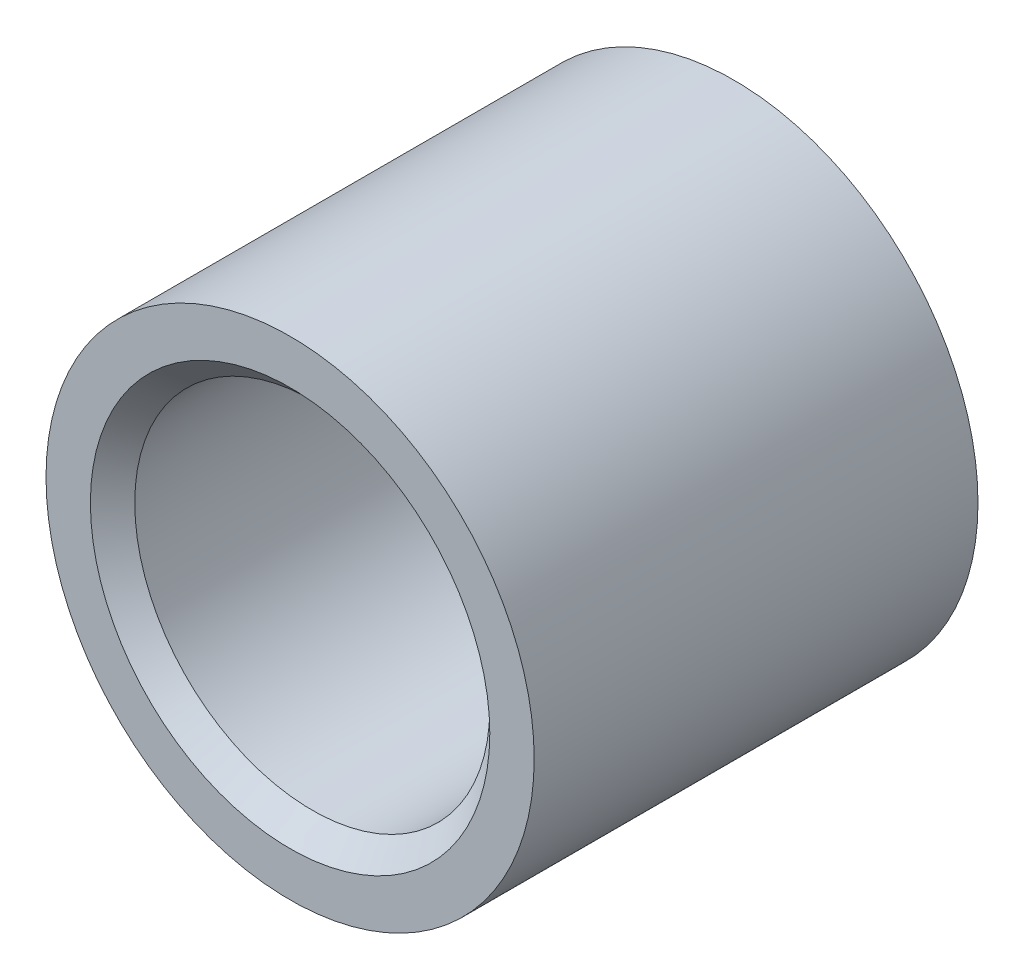
ISO-10303-21;
HEADER;
FILE_DESCRIPTION(('STEP AP214'),'2;1');
FILE_NAME('part.step','',(''),(''),'','','');
FILE_SCHEMA(('AUTOMOTIVE_DESIGN { 1 0 10303 214 1 1 1 1 }'));
ENDSEC;
DATA;
#1=APPLICATION_CONTEXT('core data for automotive mechanical design processes');
#2=APPLICATION_PROTOCOL_DEFINITION('international standard','automotive_design',2000,#1);
#3=PRODUCT_CONTEXT('',#1,'mechanical');
#4=PRODUCT('Part','Part','',(#3));
#5=PRODUCT_RELATED_PRODUCT_CATEGORY('part','',(#4));
#6=PRODUCT_DEFINITION_FORMATION('','',#4);
#7=PRODUCT_DEFINITION_CONTEXT('part definition',#1,'design');
#8=PRODUCT_DEFINITION('design','',#6,#7);
#9=PRODUCT_DEFINITION_SHAPE('','',#8);
#10=(LENGTH_UNIT() NAMED_UNIT(*) SI_UNIT(.MILLI.,.METRE.));
#11=(NAMED_UNIT(*) PLANE_ANGLE_UNIT() SI_UNIT($,.RADIAN.));
#12=(NAMED_UNIT(*) SI_UNIT($,.STERADIAN.) SOLID_ANGLE_UNIT());
#13=UNCERTAINTY_MEASURE_WITH_UNIT(LENGTH_MEASURE(1.E-05),#10,'distance_accuracy_value','');
#14=(GEOMETRIC_REPRESENTATION_CONTEXT(3) GLOBAL_UNCERTAINTY_ASSIGNED_CONTEXT((#13)) GLOBAL_UNIT_ASSIGNED_CONTEXT((#10,
#11,#12)) REPRESENTATION_CONTEXT('',''));
#15=CARTESIAN_POINT('',(0.,0.,0.));
#16=DIRECTION('',(0.,0.,1.));
#17=DIRECTION('',(1.,0.,0.));
#18=AXIS2_PLACEMENT_3D('',#15,#16,#17);
#19=CARTESIAN_POINT('',(0.,0.,25.4));
#20=DIRECTION('',(0.,0.,1.));
#21=DIRECTION('',(1.,0.,0.));
#22=AXIS2_PLACEMENT_3D('',#19,#20,#21);
#23=PLANE('',#22);
#24=CARTESIAN_POINT('',(0.,0.,25.4));
#25=DIRECTION('',(0.,0.,1.));
#26=DIRECTION('',(1.,0.,0.));
#27=AXIS2_PLACEMENT_3D('',#24,#25,#26);
#28=CIRCLE('',#27,11.43);
#29=CARTESIAN_POINT('',(11.43,0.,25.4));
#30=VERTEX_POINT('',#29);
#31=EDGE_CURVE('E10',#30,#30,#28,.F.);
#32=ORIENTED_EDGE('',*,*,#31,.T.);
#33=EDGE_LOOP('',(#32));
#34=FACE_BOUND('',#33,.T.);
#35=CARTESIAN_POINT('',(0.,0.,25.4));
#36=DIRECTION('',(0.,0.,1.));
#37=DIRECTION('',(1.,0.,0.));
#38=AXIS2_PLACEMENT_3D('',#35,#36,#37);
#39=CIRCLE('',#38,13.97);
#40=CARTESIAN_POINT('',(13.97,0.,25.4));
#41=VERTEX_POINT('',#40);
#42=EDGE_CURVE('E51',#41,#41,#39,.T.);
#43=ORIENTED_EDGE('',*,*,#42,.T.);
#44=EDGE_LOOP('',(#43));
#45=FACE_BOUND('',#44,.T.);
#46=ADVANCED_FACE('F31',(#34,#45),#23,.T.);
#47=CARTESIAN_POINT('',(0.,0.,0.));
#48=DIRECTION('',(0.,0.,1.));
#49=DIRECTION('',(1.,0.,0.));
#50=AXIS2_PLACEMENT_3D('',#47,#48,#49);
#51=PLANE('',#50);
#52=CARTESIAN_POINT('',(0.,0.,0.));
#53=DIRECTION('',(0.,0.,1.));
#54=DIRECTION('',(1.,0.,0.));
#55=AXIS2_PLACEMENT_3D('',#52,#53,#54);
#56=CIRCLE('',#55,11.43);
#57=CARTESIAN_POINT('',(-11.43,0.,0.));
#58=VERTEX_POINT('',#57);
#59=EDGE_CURVE('E46',#58,#58,#56,.T.);
#60=ORIENTED_EDGE('',*,*,#59,.T.);
#61=EDGE_LOOP('',(#60));
#62=FACE_BOUND('',#61,.T.);
#63=CARTESIAN_POINT('',(0.,0.,0.));
#64=DIRECTION('',(0.,0.,1.));
#65=DIRECTION('',(1.,0.,0.));
#66=AXIS2_PLACEMENT_3D('',#63,#64,#65);
#67=CIRCLE('',#66,13.97);
#68=CARTESIAN_POINT('',(13.97,0.,0.));
#69=VERTEX_POINT('',#68);
#70=EDGE_CURVE('E52',#69,#69,#67,.T.);
#71=ORIENTED_EDGE('',*,*,#70,.F.);
#72=EDGE_LOOP('',(#71));
#73=FACE_BOUND('',#72,.T.);
#74=ADVANCED_FACE('F63',(#62,#73),#51,.F.);
#75=CARTESIAN_POINT('',(0.,0.,25.4));
#76=DIRECTION('',(0.,0.,-1.));
#77=DIRECTION('',(-1.,0.,0.));
#78=AXIS2_PLACEMENT_3D('',#75,#76,#77);
#79=CYLINDRICAL_SURFACE('',#78,13.97);
#80=ORIENTED_EDGE('',*,*,#42,.F.);
#81=EDGE_LOOP('',(#80));
#82=FACE_BOUND('',#81,.T.);
#83=ORIENTED_EDGE('',*,*,#70,.T.);
#84=EDGE_LOOP('',(#83));
#85=FACE_BOUND('',#84,.T.);
#86=ADVANCED_FACE('F59',(#82,#85),#79,.T.);
#87=CARTESIAN_POINT('',(0.,0.,25.4));
#88=DIRECTION('',(0.,0.,-1.));
#89=DIRECTION('',(-1.,0.,0.));
#90=AXIS2_PLACEMENT_3D('',#87,#88,#89);
#91=CYLINDRICAL_SURFACE('',#90,10.16);
#92=CARTESIAN_POINT('',(0.,0.,1.27000000000001));
#93=DIRECTION('',(0.,0.,1.));
#94=DIRECTION('',(1.,0.,0.));
#95=AXIS2_PLACEMENT_3D('',#92,#93,#94);
#96=CIRCLE('',#95,10.16);
#97=CARTESIAN_POINT('',(-10.16,0.,1.27000000000001));
#98=VERTEX_POINT('',#97);
#99=EDGE_CURVE('E38',#98,#98,#96,.F.);
#100=ORIENTED_EDGE('',*,*,#99,.T.);
#101=EDGE_LOOP('',(#100));
#102=FACE_BOUND('',#101,.T.);
#103=CARTESIAN_POINT('',(0.,0.,24.13));
#104=DIRECTION('',(0.,0.,1.));
#105=DIRECTION('',(1.,0.,0.));
#106=AXIS2_PLACEMENT_3D('',#103,#104,#105);
#107=CIRCLE('',#106,10.16);
#108=CARTESIAN_POINT('',(10.16,0.,24.13));
#109=VERTEX_POINT('',#108);
#110=EDGE_CURVE('E42',#109,#109,#107,.T.);
#111=ORIENTED_EDGE('',*,*,#110,.T.);
#112=EDGE_LOOP('',(#111));
#113=FACE_BOUND('',#112,.T.);
#114=ADVANCED_FACE('F62',(#102,#113),#91,.F.);
#115=CARTESIAN_POINT('',(0.,0.,0.));
#116=DIRECTION('',(0.,0.,-1.));
#117=DIRECTION('',(-1.,0.,0.));
#118=AXIS2_PLACEMENT_3D('',#115,#116,#117);
#119=CONICAL_SURFACE('',#118,11.43,0.785398163397446);
#120=CARTESIAN_POINT('',(-10.16,0.,1.27000000000001));
#121=CARTESIAN_POINT('',(-10.1732291666667,0.,1.25677083333334));
#122=CARTESIAN_POINT('',(-10.1864583333333,0.,1.24354166666668));
#123=CARTESIAN_POINT('',(-10.2129166666667,0.,1.21708333333334));
#124=CARTESIAN_POINT('',(-10.2261458333333,0.,1.20385416666668));
#125=CARTESIAN_POINT('',(-10.2526041666667,0.,1.17739583333334));
#126=CARTESIAN_POINT('',(-10.2658333333333,0.,1.16416666666668));
#127=CARTESIAN_POINT('',(-10.2922916666667,0.,1.13770833333334));
#128=CARTESIAN_POINT('',(-10.3055208333333,0.,1.12447916666668));
#129=CARTESIAN_POINT('',(-10.3319791666667,0.,1.09802083333334));
#130=CARTESIAN_POINT('',(-10.3452083333333,0.,1.08479166666668));
#131=CARTESIAN_POINT('',(-10.3716666666667,0.,1.05833333333334));
#132=CARTESIAN_POINT('',(-10.3848958333333,0.,1.04510416666668));
#133=CARTESIAN_POINT('',(-10.4113541666667,0.,1.01864583333334));
#134=CARTESIAN_POINT('',(-10.4245833333333,0.,1.00541666666667));
#135=CARTESIAN_POINT('',(-10.4510416666667,0.,0.978958333333341));
#136=CARTESIAN_POINT('',(-10.4642708333333,0.,0.965729166666675));
#137=CARTESIAN_POINT('',(-10.4907291666667,0.,0.939270833333341));
#138=CARTESIAN_POINT('',(-10.5039583333333,0.,0.926041666666674));
#139=CARTESIAN_POINT('',(-10.5304166666667,0.,0.899583333333341));
#140=CARTESIAN_POINT('',(-10.5436458333333,0.,0.886354166666674));
#141=CARTESIAN_POINT('',(-10.5701041666667,0.,0.85989583333334));
#142=CARTESIAN_POINT('',(-10.5833333333333,0.,0.846666666666674));
#143=CARTESIAN_POINT('',(-10.6097916666667,0.,0.82020833333334));
#144=CARTESIAN_POINT('',(-10.6230208333333,0.,0.806979166666673));
#145=CARTESIAN_POINT('',(-10.6494791666667,0.,0.78052083333334));
#146=CARTESIAN_POINT('',(-10.6627083333333,0.,0.767291666666673));
#147=CARTESIAN_POINT('',(-10.6891666666667,0.,0.740833333333339));
#148=CARTESIAN_POINT('',(-10.7023958333333,0.,0.727604166666673));
#149=CARTESIAN_POINT('',(-10.7288541666667,0.,0.701145833333339));
#150=CARTESIAN_POINT('',(-10.7420833333333,0.,0.687916666666672));
#151=CARTESIAN_POINT('',(-10.7685416666667,0.,0.661458333333339));
#152=CARTESIAN_POINT('',(-10.7817708333333,0.,0.648229166666672));
#153=CARTESIAN_POINT('',(-10.8082291666667,0.,0.621770833333338));
#154=CARTESIAN_POINT('',(-10.8214583333333,0.,0.608541666666672));
#155=CARTESIAN_POINT('',(-10.8479166666667,0.,0.582083333333338));
#156=CARTESIAN_POINT('',(-10.8611458333333,0.,0.568854166666671));
#157=CARTESIAN_POINT('',(-10.8876041666667,0.,0.542395833333338));
#158=CARTESIAN_POINT('',(-10.9008333333333,0.,0.529166666666671));
#159=CARTESIAN_POINT('',(-10.9272916666667,0.,0.502708333333337));
#160=CARTESIAN_POINT('',(-10.9405208333333,0.,0.489479166666671));
#161=CARTESIAN_POINT('',(-10.9669791666667,0.,0.463020833333337));
#162=CARTESIAN_POINT('',(-10.9802083333333,0.,0.44979166666667));
#163=CARTESIAN_POINT('',(-11.0066666666667,0.,0.423333333333337));
#164=CARTESIAN_POINT('',(-11.0198958333333,0.,0.41010416666667));
#165=CARTESIAN_POINT('',(-11.0463541666667,0.,0.383645833333336));
#166=CARTESIAN_POINT('',(-11.0595833333333,0.,0.37041666666667));
#167=CARTESIAN_POINT('',(-11.0860416666667,0.,0.343958333333336));
#168=CARTESIAN_POINT('',(-11.0992708333333,0.,0.330729166666669));
#169=CARTESIAN_POINT('',(-11.1257291666667,0.,0.304270833333336));
#170=CARTESIAN_POINT('',(-11.1389583333333,0.,0.291041666666669));
#171=CARTESIAN_POINT('',(-11.1654166666667,0.,0.264583333333336));
#172=CARTESIAN_POINT('',(-11.1786458333333,0.,0.251354166666669));
#173=CARTESIAN_POINT('',(-11.2051041666667,0.,0.224895833333335));
#174=CARTESIAN_POINT('',(-11.2183333333333,0.,0.211666666666668));
#175=CARTESIAN_POINT('',(-11.2447916666667,0.,0.185208333333335));
#176=CARTESIAN_POINT('',(-11.2580208333333,0.,0.171979166666668));
#177=CARTESIAN_POINT('',(-11.2844791666667,0.,0.145520833333335));
#178=CARTESIAN_POINT('',(-11.2977083333333,0.,0.132291666666668));
#179=CARTESIAN_POINT('',(-11.3241666666667,0.,0.105833333333334));
#180=CARTESIAN_POINT('',(-11.3373958333333,0.,0.0926041666666676));
#181=CARTESIAN_POINT('',(-11.3638541666667,0.,0.066145833333334));
#182=CARTESIAN_POINT('',(-11.3770833333333,0.,0.0529166666666671));
#183=CARTESIAN_POINT('',(-11.4035416666667,0.,0.0264583333333334));
#184=CARTESIAN_POINT('',(-11.4167708333333,0.,0.0132291666666665));
#185=CARTESIAN_POINT('',(-11.43,0.,0.));
#186=B_SPLINE_CURVE_WITH_KNOTS('',3,(#120,#121,#122,#123,#124,#125,#126,#127,#128,#129,#130,
#131,#132,#133,#134,#135,#136,#137,#138,#139,#140,#141,#142,#143,#144,#145,#146,#147,#148,#149,
#150,#151,#152,#153,#154,#155,#156,#157,#158,#159,#160,#161,#162,#163,#164,#165,#166,#167,#168,
#169,#170,#171,#172,#173,#174,#175,#176,#177,#178,#179,#180,#181,#182,#183,#184,#185),
.UNSPECIFIED.,.F.,.F.,(4,2,2,2,2,2,2,2,2,2,2,2,2,2,2,2,2,2,2,2,2,2,2,2,2,2,2,2,2,2,2,2,4),(0.,
0.0561266007566822,0.112253201513366,0.168379802270048,0.22450640302673,0.280633003783413,
0.336759604540095,0.392886205296779,0.449012806053461,0.505139406810143,0.561266007566825,
0.617392608323508,0.673519209080191,0.729645809836874,0.785772410593556,0.841899011350238,
0.898025612106921,0.954152212863604,1.01027881362029,1.06640541437697,1.12253201513365,
1.17865861589033,1.23478521664702,1.2909118174037,1.34703841816038,1.40316501891706,
1.45929161967375,1.51541822043043,1.57154482118711,1.62767142194379,1.68379802270048,
1.73992462345716,1.79605122421384),.UNSPECIFIED.);
#187=EDGE_CURVE('BSEAM75',#98,#58,#186,.T.);
#188=ORIENTED_EDGE('',*,*,#99,.F.);
#189=ORIENTED_EDGE('',*,*,#59,.F.);
#190=ORIENTED_EDGE('',*,*,#187,.T.);
#191=ORIENTED_EDGE('',*,*,#187,.F.);
#192=EDGE_LOOP('',(#188,#190,#189,#191));
#193=FACE_BOUND('',#192,.T.);
#194=ADVANCED_FACE('F75',(#193),#119,.F.);
#195=CARTESIAN_POINT('',(0.,0.,24.13));
#196=DIRECTION('',(0.,0.,1.));
#197=DIRECTION('',(1.,0.,0.));
#198=AXIS2_PLACEMENT_3D('',#195,#196,#197);
#199=CONICAL_SURFACE('',#198,10.16,0.785398163397449);
#200=ORIENTED_EDGE('',*,*,#31,.F.);
#201=EDGE_LOOP('',(#200));
#202=FACE_BOUND('',#201,.T.);
#203=ORIENTED_EDGE('',*,*,#110,.F.);
#204=EDGE_LOOP('',(#203));
#205=FACE_BOUND('',#204,.T.);
#206=ADVANCED_FACE('F33',(#202,#205),#199,.F.);
#207=CLOSED_SHELL('',(#46,#74,#86,#114,#194,#206));
#208=MANIFOLD_SOLID_BREP('B2',#207);
#209=ADVANCED_BREP_SHAPE_REPRESENTATION('',(#18,#208),#14);
#210=SHAPE_DEFINITION_REPRESENTATION(#9,#209);
ENDSEC;
END-ISO-10303-21;
